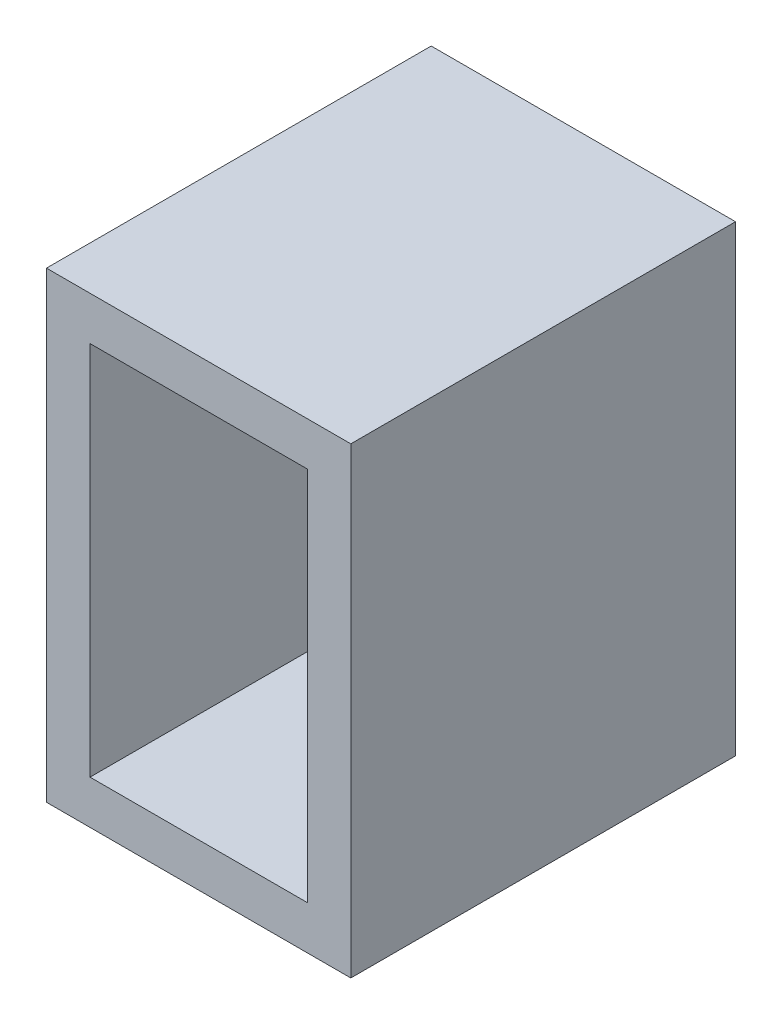
ISO-10303-21;
HEADER;
FILE_DESCRIPTION(('STEP AP214'),'2;1');
FILE_NAME('part.step','',(''),(''),'','','');
FILE_SCHEMA(('AUTOMOTIVE_DESIGN { 1 0 10303 214 1 1 1 1 }'));
ENDSEC;
DATA;
#1=APPLICATION_CONTEXT('core data for automotive mechanical design processes');
#2=APPLICATION_PROTOCOL_DEFINITION('international standard','automotive_design',2000,#1);
#3=PRODUCT_CONTEXT('',#1,'mechanical');
#4=PRODUCT('Part','Part','',(#3));
#5=PRODUCT_RELATED_PRODUCT_CATEGORY('part','',(#4));
#6=PRODUCT_DEFINITION_FORMATION('','',#4);
#7=PRODUCT_DEFINITION_CONTEXT('part definition',#1,'design');
#8=PRODUCT_DEFINITION('design','',#6,#7);
#9=PRODUCT_DEFINITION_SHAPE('','',#8);
#10=(LENGTH_UNIT() NAMED_UNIT(*) SI_UNIT(.MILLI.,.METRE.));
#11=(NAMED_UNIT(*) PLANE_ANGLE_UNIT() SI_UNIT($,.RADIAN.));
#12=(NAMED_UNIT(*) SI_UNIT($,.STERADIAN.) SOLID_ANGLE_UNIT());
#13=UNCERTAINTY_MEASURE_WITH_UNIT(LENGTH_MEASURE(1.E-05),#10,'distance_accuracy_value','');
#14=(GEOMETRIC_REPRESENTATION_CONTEXT(3) GLOBAL_UNCERTAINTY_ASSIGNED_CONTEXT((#13)) GLOBAL_UNIT_ASSIGNED_CONTEXT((#10,
#11,#12)) REPRESENTATION_CONTEXT('',''));
#15=CARTESIAN_POINT('',(0.,0.,0.));
#16=DIRECTION('',(0.,0.,1.));
#17=DIRECTION('',(1.,0.,0.));
#18=AXIS2_PLACEMENT_3D('',#15,#16,#17);
#19=CARTESIAN_POINT('',(-9.96914225739982,26.9472807017544,28.));
#20=DIRECTION('',(1.,0.,0.));
#21=DIRECTION('',(0.,1.,0.));
#22=AXIS2_PLACEMENT_3D('',#19,#20,#21);
#23=PLANE('',#22);
#24=DIRECTION('',(0.,-1.,0.));
#25=VECTOR('',#24,1.);
#26=CARTESIAN_POINT('',(-9.96914225739982,26.9472807017544,0.));
#27=LINE('',#26,#25);
#28=CARTESIAN_POINT('',(-9.96914225739982,26.9472807017544,0.));
#29=VERTEX_POINT('',#28);
#30=CARTESIAN_POINT('',(-9.96914225739981,-6.72271929824562,0.));
#31=VERTEX_POINT('',#30);
#32=EDGE_CURVE('E141',#29,#31,#27,.T.);
#33=ORIENTED_EDGE('',*,*,#32,.T.);
#34=DIRECTION('',(0.,0.,-1.));
#35=VECTOR('',#34,1.);
#36=CARTESIAN_POINT('',(-9.96914225739981,-6.72271929824562,28.));
#37=LINE('',#36,#35);
#38=CARTESIAN_POINT('',(-9.96914225739981,-6.72271929824562,28.));
#39=VERTEX_POINT('',#38);
#40=EDGE_CURVE('E11',#39,#31,#37,.T.);
#41=ORIENTED_EDGE('',*,*,#40,.F.);
#42=DIRECTION('',(0.,-1.,0.));
#43=VECTOR('',#42,1.);
#44=CARTESIAN_POINT('',(-9.96914225739982,26.9472807017544,28.));
#45=LINE('',#44,#43);
#46=CARTESIAN_POINT('',(-9.96914225739982,26.9472807017544,28.));
#47=VERTEX_POINT('',#46);
#48=EDGE_CURVE('E145',#47,#39,#45,.T.);
#49=ORIENTED_EDGE('',*,*,#48,.F.);
#50=DIRECTION('',(0.,0.,-1.));
#51=VECTOR('',#50,1.);
#52=CARTESIAN_POINT('',(-9.96914225739982,26.9472807017544,28.));
#53=LINE('',#52,#51);
#54=EDGE_CURVE('E151',#47,#29,#53,.T.);
#55=ORIENTED_EDGE('',*,*,#54,.T.);
#56=EDGE_LOOP('',(#33,#41,#49,#55));
#57=FACE_BOUND('',#56,.T.);
#58=ADVANCED_FACE('F33',(#57),#23,.F.);
#59=CARTESIAN_POINT('',(-9.96914225739981,-6.72271929824562,28.));
#60=DIRECTION('',(0.,1.,0.));
#61=DIRECTION('',(0.,0.,1.));
#62=AXIS2_PLACEMENT_3D('',#59,#60,#61);
#63=PLANE('',#62);
#64=DIRECTION('',(1.,0.,0.));
#65=VECTOR('',#64,1.);
#66=CARTESIAN_POINT('',(-9.96914225739981,-6.72271929824562,0.));
#67=LINE('',#66,#65);
#68=CARTESIAN_POINT('',(12.1808577426002,-6.72271929824562,0.));
#69=VERTEX_POINT('',#68);
#70=EDGE_CURVE('E154',#31,#69,#67,.T.);
#71=ORIENTED_EDGE('',*,*,#70,.T.);
#72=DIRECTION('',(0.,0.,-1.));
#73=VECTOR('',#72,1.);
#74=CARTESIAN_POINT('',(12.1808577426002,-6.72271929824562,28.));
#75=LINE('',#74,#73);
#76=CARTESIAN_POINT('',(12.1808577426002,-6.72271929824562,28.));
#77=VERTEX_POINT('',#76);
#78=EDGE_CURVE('E40',#77,#69,#75,.T.);
#79=ORIENTED_EDGE('',*,*,#78,.F.);
#80=DIRECTION('',(1.,0.,0.));
#81=VECTOR('',#80,1.);
#82=CARTESIAN_POINT('',(-9.96914225739981,-6.72271929824562,28.));
#83=LINE('',#82,#81);
#84=EDGE_CURVE('E84',#39,#77,#83,.T.);
#85=ORIENTED_EDGE('',*,*,#84,.F.);
#86=ORIENTED_EDGE('',*,*,#40,.T.);
#87=EDGE_LOOP('',(#71,#79,#85,#86));
#88=FACE_BOUND('',#87,.T.);
#89=ADVANCED_FACE('F183',(#88),#63,.F.);
#90=CARTESIAN_POINT('',(12.1808577426002,26.9472807017544,28.));
#91=DIRECTION('',(-1.,0.,0.));
#92=DIRECTION('',(0.,-1.,0.));
#93=AXIS2_PLACEMENT_3D('',#90,#91,#92);
#94=PLANE('',#93);
#95=DIRECTION('',(0.,1.,0.));
#96=VECTOR('',#95,1.);
#97=CARTESIAN_POINT('',(12.1808577426002,26.9472807017544,0.));
#98=LINE('',#97,#96);
#99=CARTESIAN_POINT('',(12.1808577426002,26.9472807017544,0.));
#100=VERTEX_POINT('',#99);
#101=EDGE_CURVE('E156',#69,#100,#98,.T.);
#102=ORIENTED_EDGE('',*,*,#101,.T.);
#103=DIRECTION('',(0.,0.,-1.));
#104=VECTOR('',#103,1.);
#105=CARTESIAN_POINT('',(12.1808577426002,26.9472807017544,28.));
#106=LINE('',#105,#104);
#107=CARTESIAN_POINT('',(12.1808577426002,26.9472807017544,28.));
#108=VERTEX_POINT('',#107);
#109=EDGE_CURVE('E160',#108,#100,#106,.T.);
#110=ORIENTED_EDGE('',*,*,#109,.F.);
#111=DIRECTION('',(0.,1.,0.));
#112=VECTOR('',#111,1.);
#113=CARTESIAN_POINT('',(12.1808577426002,26.9472807017544,28.));
#114=LINE('',#113,#112);
#115=EDGE_CURVE('E148',#77,#108,#114,.T.);
#116=ORIENTED_EDGE('',*,*,#115,.F.);
#117=ORIENTED_EDGE('',*,*,#78,.T.);
#118=EDGE_LOOP('',(#102,#110,#116,#117));
#119=FACE_BOUND('',#118,.T.);
#120=ADVANCED_FACE('F165',(#119),#94,.F.);
#121=CARTESIAN_POINT('',(-9.96914225739982,26.9472807017544,28.));
#122=DIRECTION('',(0.,-1.,0.));
#123=DIRECTION('',(0.,0.,-1.));
#124=AXIS2_PLACEMENT_3D('',#121,#122,#123);
#125=PLANE('',#124);
#126=DIRECTION('',(-1.,0.,0.));
#127=VECTOR('',#126,1.);
#128=CARTESIAN_POINT('',(-9.96914225739982,26.9472807017544,0.));
#129=LINE('',#128,#127);
#130=EDGE_CURVE('E77',#100,#29,#129,.T.);
#131=ORIENTED_EDGE('',*,*,#130,.T.);
#132=ORIENTED_EDGE('',*,*,#54,.F.);
#133=DIRECTION('',(-1.,0.,0.));
#134=VECTOR('',#133,1.);
#135=CARTESIAN_POINT('',(-9.96914225739982,26.9472807017544,28.));
#136=LINE('',#135,#134);
#137=EDGE_CURVE('E56',#108,#47,#136,.T.);
#138=ORIENTED_EDGE('',*,*,#137,.F.);
#139=ORIENTED_EDGE('',*,*,#109,.T.);
#140=EDGE_LOOP('',(#131,#132,#138,#139));
#141=FACE_BOUND('',#140,.T.);
#142=ADVANCED_FACE('F173',(#141),#125,.F.);
#143=CARTESIAN_POINT('',(0.,0.,28.));
#144=DIRECTION('',(0.,0.,1.));
#145=DIRECTION('',(1.,0.,0.));
#146=AXIS2_PLACEMENT_3D('',#143,#144,#145);
#147=PLANE('',#146);
#148=DIRECTION('',(0.,-1.,0.));
#149=VECTOR('',#148,1.);
#150=CARTESIAN_POINT('',(-6.79914225739982,23.7772807017544,28.));
#151=LINE('',#150,#149);
#152=CARTESIAN_POINT('',(-6.79914225739982,23.7772807017544,28.));
#153=VERTEX_POINT('',#152);
#154=CARTESIAN_POINT('',(-6.79914225739981,-3.55271929824562,28.));
#155=VERTEX_POINT('',#154);
#156=EDGE_CURVE('E47',#153,#155,#151,.T.);
#157=ORIENTED_EDGE('',*,*,#156,.F.);
#158=DIRECTION('',(-1.,0.,0.));
#159=VECTOR('',#158,1.);
#160=CARTESIAN_POINT('',(-6.79914225739982,23.7772807017544,28.));
#161=LINE('',#160,#159);
#162=CARTESIAN_POINT('',(9.01085774260019,23.7772807017544,28.));
#163=VERTEX_POINT('',#162);
#164=EDGE_CURVE('E126',#163,#153,#161,.T.);
#165=ORIENTED_EDGE('',*,*,#164,.F.);
#166=DIRECTION('',(0.,1.,0.));
#167=VECTOR('',#166,1.);
#168=CARTESIAN_POINT('',(9.01085774260019,23.7772807017544,28.));
#169=LINE('',#168,#167);
#170=CARTESIAN_POINT('',(9.01085774260019,-3.55271929824562,28.));
#171=VERTEX_POINT('',#170);
#172=EDGE_CURVE('E129',#171,#163,#169,.T.);
#173=ORIENTED_EDGE('',*,*,#172,.F.);
#174=DIRECTION('',(1.,0.,0.));
#175=VECTOR('',#174,1.);
#176=CARTESIAN_POINT('',(-6.79914225739981,-3.55271929824562,28.));
#177=LINE('',#176,#175);
#178=EDGE_CURVE('E135',#155,#171,#177,.T.);
#179=ORIENTED_EDGE('',*,*,#178,.F.);
#180=EDGE_LOOP('',(#157,#165,#173,#179));
#181=FACE_BOUND('',#180,.T.);
#182=ORIENTED_EDGE('',*,*,#48,.T.);
#183=ORIENTED_EDGE('',*,*,#84,.T.);
#184=ORIENTED_EDGE('',*,*,#115,.T.);
#185=ORIENTED_EDGE('',*,*,#137,.T.);
#186=EDGE_LOOP('',(#182,#183,#184,#185));
#187=FACE_BOUND('',#186,.T.);
#188=ADVANCED_FACE('F175',(#181,#187),#147,.T.);
#189=CARTESIAN_POINT('',(0.,0.,0.));
#190=DIRECTION('',(0.,0.,1.));
#191=DIRECTION('',(1.,0.,0.));
#192=AXIS2_PLACEMENT_3D('',#189,#190,#191);
#193=PLANE('',#192);
#194=ORIENTED_EDGE('',*,*,#32,.F.);
#195=ORIENTED_EDGE('',*,*,#130,.F.);
#196=ORIENTED_EDGE('',*,*,#101,.F.);
#197=ORIENTED_EDGE('',*,*,#70,.F.);
#198=EDGE_LOOP('',(#194,#195,#196,#197));
#199=FACE_BOUND('',#198,.T.);
#200=ADVANCED_FACE('F169',(#199),#193,.F.);
#201=CARTESIAN_POINT('',(-6.79914225739982,23.7772807017544,3.));
#202=DIRECTION('',(-1.,0.,0.));
#203=DIRECTION('',(0.,-1.,0.));
#204=AXIS2_PLACEMENT_3D('',#201,#202,#203);
#205=PLANE('',#204);
#206=ORIENTED_EDGE('',*,*,#156,.T.);
#207=DIRECTION('',(0.,0.,1.));
#208=VECTOR('',#207,1.);
#209=CARTESIAN_POINT('',(-6.79914225739981,-3.55271929824562,3.));
#210=LINE('',#209,#208);
#211=CARTESIAN_POINT('',(-6.79914225739981,-3.55271929824562,3.));
#212=VERTEX_POINT('',#211);
#213=EDGE_CURVE('E104',#212,#155,#210,.T.);
#214=ORIENTED_EDGE('',*,*,#213,.F.);
#215=DIRECTION('',(0.,-1.,0.));
#216=VECTOR('',#215,1.);
#217=CARTESIAN_POINT('',(-6.79914225739982,23.7772807017544,3.));
#218=LINE('',#217,#216);
#219=CARTESIAN_POINT('',(-6.79914225739982,23.7772807017544,3.));
#220=VERTEX_POINT('',#219);
#221=EDGE_CURVE('E108',#220,#212,#218,.T.);
#222=ORIENTED_EDGE('',*,*,#221,.F.);
#223=DIRECTION('',(0.,0.,1.));
#224=VECTOR('',#223,1.);
#225=CARTESIAN_POINT('',(-6.79914225739982,23.7772807017544,3.));
#226=LINE('',#225,#224);
#227=EDGE_CURVE('E139',#220,#153,#226,.T.);
#228=ORIENTED_EDGE('',*,*,#227,.T.);
#229=EDGE_LOOP('',(#206,#214,#222,#228));
#230=FACE_BOUND('',#229,.T.);
#231=ADVANCED_FACE('F106',(#230),#205,.F.);
#232=CARTESIAN_POINT('',(-6.79914225739982,23.7772807017544,3.));
#233=DIRECTION('',(0.,1.,0.));
#234=DIRECTION('',(0.,0.,1.));
#235=AXIS2_PLACEMENT_3D('',#232,#233,#234);
#236=PLANE('',#235);
#237=ORIENTED_EDGE('',*,*,#164,.T.);
#238=ORIENTED_EDGE('',*,*,#227,.F.);
#239=DIRECTION('',(-1.,0.,0.));
#240=VECTOR('',#239,1.);
#241=CARTESIAN_POINT('',(-6.79914225739982,23.7772807017544,3.));
#242=LINE('',#241,#240);
#243=CARTESIAN_POINT('',(9.01085774260019,23.7772807017544,3.));
#244=VERTEX_POINT('',#243);
#245=EDGE_CURVE('E114',#244,#220,#242,.T.);
#246=ORIENTED_EDGE('',*,*,#245,.F.);
#247=DIRECTION('',(0.,0.,1.));
#248=VECTOR('',#247,1.);
#249=CARTESIAN_POINT('',(9.01085774260019,23.7772807017544,3.));
#250=LINE('',#249,#248);
#251=EDGE_CURVE('E142',#244,#163,#250,.T.);
#252=ORIENTED_EDGE('',*,*,#251,.T.);
#253=EDGE_LOOP('',(#237,#238,#246,#252));
#254=FACE_BOUND('',#253,.T.);
#255=ADVANCED_FACE('F222',(#254),#236,.F.);
#256=CARTESIAN_POINT('',(9.01085774260019,23.7772807017544,3.));
#257=DIRECTION('',(1.,0.,0.));
#258=DIRECTION('',(0.,0.,-1.));
#259=AXIS2_PLACEMENT_3D('',#256,#257,#258);
#260=PLANE('',#259);
#261=ORIENTED_EDGE('',*,*,#172,.T.);
#262=ORIENTED_EDGE('',*,*,#251,.F.);
#263=DIRECTION('',(0.,1.,0.));
#264=VECTOR('',#263,1.);
#265=CARTESIAN_POINT('',(9.01085774260019,23.7772807017544,3.));
#266=LINE('',#265,#264);
#267=CARTESIAN_POINT('',(9.01085774260019,-3.55271929824562,3.));
#268=VERTEX_POINT('',#267);
#269=EDGE_CURVE('E122',#268,#244,#266,.T.);
#270=ORIENTED_EDGE('',*,*,#269,.F.);
#271=DIRECTION('',(0.,0.,1.));
#272=VECTOR('',#271,1.);
#273=CARTESIAN_POINT('',(9.01085774260019,-3.55271929824562,3.));
#274=LINE('',#273,#272);
#275=EDGE_CURVE('E113',#268,#171,#274,.T.);
#276=ORIENTED_EDGE('',*,*,#275,.T.);
#277=EDGE_LOOP('',(#261,#262,#270,#276));
#278=FACE_BOUND('',#277,.T.);
#279=ADVANCED_FACE('F231',(#278),#260,.F.);
#280=CARTESIAN_POINT('',(-6.79914225739981,-3.55271929824562,3.));
#281=DIRECTION('',(0.,-1.,0.));
#282=DIRECTION('',(0.,0.,-1.));
#283=AXIS2_PLACEMENT_3D('',#280,#281,#282);
#284=PLANE('',#283);
#285=ORIENTED_EDGE('',*,*,#178,.T.);
#286=ORIENTED_EDGE('',*,*,#275,.F.);
#287=DIRECTION('',(1.,0.,0.));
#288=VECTOR('',#287,1.);
#289=CARTESIAN_POINT('',(-6.79914225739981,-3.55271929824562,3.));
#290=LINE('',#289,#288);
#291=EDGE_CURVE('E117',#212,#268,#290,.T.);
#292=ORIENTED_EDGE('',*,*,#291,.F.);
#293=ORIENTED_EDGE('',*,*,#213,.T.);
#294=EDGE_LOOP('',(#285,#286,#292,#293));
#295=FACE_BOUND('',#294,.T.);
#296=ADVANCED_FACE('F118',(#295),#284,.F.);
#297=CARTESIAN_POINT('',(0.,0.,3.));
#298=DIRECTION('',(0.,0.,1.));
#299=DIRECTION('',(1.,0.,0.));
#300=AXIS2_PLACEMENT_3D('',#297,#298,#299);
#301=PLANE('',#300);
#302=ORIENTED_EDGE('',*,*,#221,.T.);
#303=ORIENTED_EDGE('',*,*,#291,.T.);
#304=ORIENTED_EDGE('',*,*,#269,.T.);
#305=ORIENTED_EDGE('',*,*,#245,.T.);
#306=EDGE_LOOP('',(#302,#303,#304,#305));
#307=FACE_BOUND('',#306,.T.);
#308=ADVANCED_FACE('F124',(#307),#301,.T.);
#309=CLOSED_SHELL('',(#58,#89,#120,#142,#188,#200,#231,#255,#279,#296,#308));
#310=MANIFOLD_SOLID_BREP('B2',#309);
#311=ADVANCED_BREP_SHAPE_REPRESENTATION('',(#18,#310),#14);
#312=SHAPE_DEFINITION_REPRESENTATION(#9,#311);
ENDSEC;
END-ISO-10303-21;
